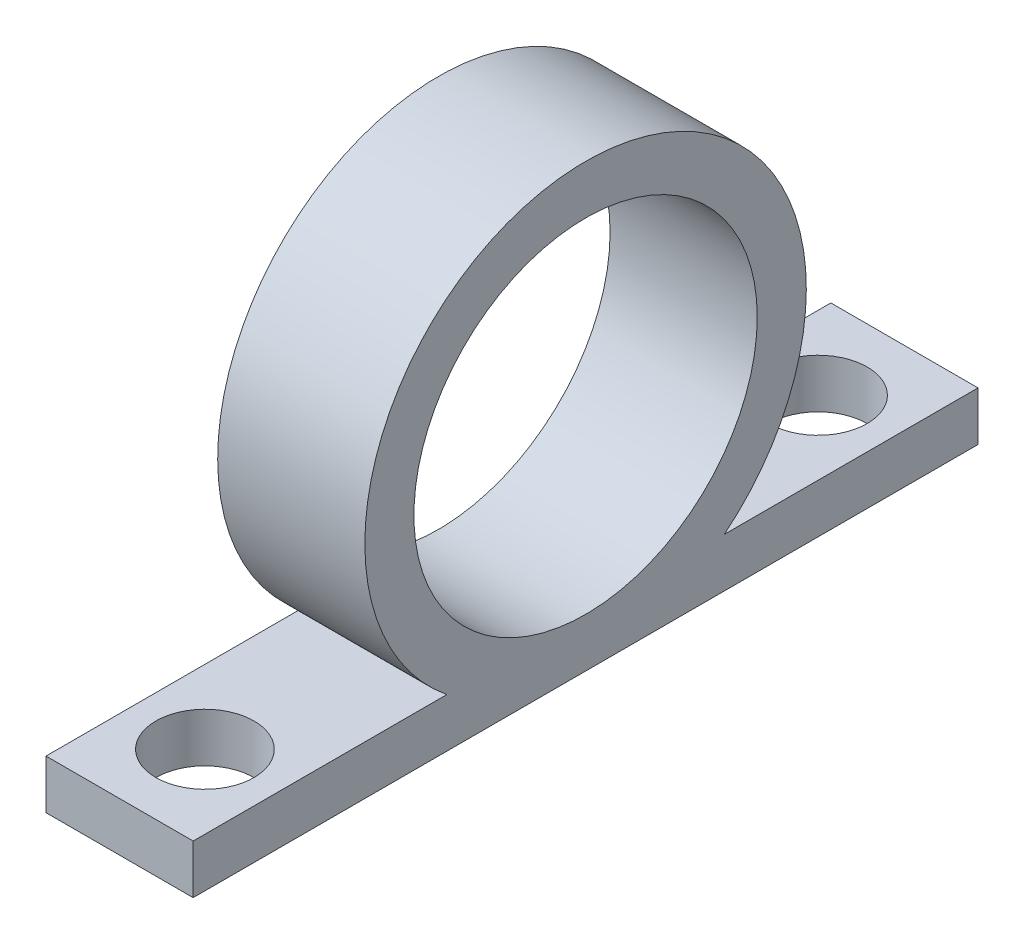
ISO-10303-21;
HEADER;
FILE_DESCRIPTION(('STEP AP214'),'2;1');
FILE_NAME('part.step','',(''),(''),'','','');
FILE_SCHEMA(('AUTOMOTIVE_DESIGN { 1 0 10303 214 1 1 1 1 }'));
ENDSEC;
DATA;
#1=APPLICATION_CONTEXT('core data for automotive mechanical design processes');
#2=APPLICATION_PROTOCOL_DEFINITION('international standard','automotive_design',2000,#1);
#3=PRODUCT_CONTEXT('',#1,'mechanical');
#4=PRODUCT('Part','Part','',(#3));
#5=PRODUCT_RELATED_PRODUCT_CATEGORY('part','',(#4));
#6=PRODUCT_DEFINITION_FORMATION('','',#4);
#7=PRODUCT_DEFINITION_CONTEXT('part definition',#1,'design');
#8=PRODUCT_DEFINITION('design','',#6,#7);
#9=PRODUCT_DEFINITION_SHAPE('','',#8);
#10=(LENGTH_UNIT() NAMED_UNIT(*) SI_UNIT(.MILLI.,.METRE.));
#11=(NAMED_UNIT(*) PLANE_ANGLE_UNIT() SI_UNIT($,.RADIAN.));
#12=(NAMED_UNIT(*) SI_UNIT($,.STERADIAN.) SOLID_ANGLE_UNIT());
#13=UNCERTAINTY_MEASURE_WITH_UNIT(LENGTH_MEASURE(1.E-05),#10,'distance_accuracy_value','');
#14=(GEOMETRIC_REPRESENTATION_CONTEXT(3) GLOBAL_UNCERTAINTY_ASSIGNED_CONTEXT((#13)) GLOBAL_UNIT_ASSIGNED_CONTEXT((#10,
#11,#12)) REPRESENTATION_CONTEXT('',''));
#15=CARTESIAN_POINT('',(0.,0.,0.));
#16=DIRECTION('',(0.,0.,1.));
#17=DIRECTION('',(1.,0.,0.));
#18=AXIS2_PLACEMENT_3D('',#15,#16,#17);
#19=CARTESIAN_POINT('',(30.,0.,0.));
#20=DIRECTION('',(1.,0.,0.));
#21=DIRECTION('',(0.,0.,-1.));
#22=AXIS2_PLACEMENT_3D('',#19,#20,#21);
#23=PLANE('',#22);
#24=CARTESIAN_POINT('',(30.,0.,0.));
#25=DIRECTION('',(1.,0.,0.));
#26=DIRECTION('',(0.,0.,-1.));
#27=AXIS2_PLACEMENT_3D('',#24,#25,#26);
#28=CIRCLE('',#27,45.);
#29=CARTESIAN_POINT('',(30.,-35.,-28.2842712474619));
#30=VERTEX_POINT('',#29);
#31=CARTESIAN_POINT('',(30.,-35.,28.2842712474619));
#32=VERTEX_POINT('',#31);
#33=EDGE_CURVE('E147',#30,#32,#28,.T.);
#34=ORIENTED_EDGE('',*,*,#33,.T.);
#35=DIRECTION('',(0.,0.,1.));
#36=VECTOR('',#35,1.);
#37=CARTESIAN_POINT('',(30.,-35.,80.));
#38=LINE('',#37,#36);
#39=CARTESIAN_POINT('',(30.,-35.,80.));
#40=VERTEX_POINT('',#39);
#41=EDGE_CURVE('E95',#32,#40,#38,.T.);
#42=ORIENTED_EDGE('',*,*,#41,.T.);
#43=DIRECTION('',(0.,-1.,0.));
#44=VECTOR('',#43,1.);
#45=CARTESIAN_POINT('',(30.,-45.,80.));
#46=LINE('',#45,#44);
#47=CARTESIAN_POINT('',(30.,-45.,80.));
#48=VERTEX_POINT('',#47);
#49=EDGE_CURVE('E108',#40,#48,#46,.T.);
#50=ORIENTED_EDGE('',*,*,#49,.T.);
#51=DIRECTION('',(0.,0.,-1.));
#52=VECTOR('',#51,1.);
#53=CARTESIAN_POINT('',(30.,-45.,0.));
#54=LINE('',#53,#52);
#55=CARTESIAN_POINT('',(30.,-45.,-80.));
#56=VERTEX_POINT('',#55);
#57=EDGE_CURVE('E102',#48,#56,#54,.T.);
#58=ORIENTED_EDGE('',*,*,#57,.T.);
#59=DIRECTION('',(0.,1.,0.));
#60=VECTOR('',#59,1.);
#61=CARTESIAN_POINT('',(30.,-35.,-80.));
#62=LINE('',#61,#60);
#63=CARTESIAN_POINT('',(30.,-35.,-80.));
#64=VERTEX_POINT('',#63);
#65=EDGE_CURVE('E106',#56,#64,#62,.T.);
#66=ORIENTED_EDGE('',*,*,#65,.T.);
#67=DIRECTION('',(0.,0.,1.));
#68=VECTOR('',#67,1.);
#69=CARTESIAN_POINT('',(30.,-35.,-28.2842712474619));
#70=LINE('',#69,#68);
#71=EDGE_CURVE('E58',#64,#30,#70,.T.);
#72=ORIENTED_EDGE('',*,*,#71,.T.);
#73=EDGE_LOOP('',(#34,#42,#50,#58,#66,#72));
#74=FACE_BOUND('',#73,.T.);
#75=CARTESIAN_POINT('',(30.,0.,0.));
#76=DIRECTION('',(1.,0.,0.));
#77=DIRECTION('',(0.,0.,-1.));
#78=AXIS2_PLACEMENT_3D('',#75,#76,#77);
#79=CIRCLE('',#78,35.);
#80=CARTESIAN_POINT('',(30.,0.,-35.));
#81=VERTEX_POINT('',#80);
#82=EDGE_CURVE('E134',#81,#81,#79,.T.);
#83=ORIENTED_EDGE('',*,*,#82,.F.);
#84=EDGE_LOOP('',(#83));
#85=FACE_BOUND('',#84,.T.);
#86=ADVANCED_FACE('F39',(#74,#85),#23,.T.);
#87=CARTESIAN_POINT('',(0.,0.,0.));
#88=DIRECTION('',(1.,0.,0.));
#89=DIRECTION('',(0.,0.,-1.));
#90=AXIS2_PLACEMENT_3D('',#87,#88,#89);
#91=PLANE('',#90);
#92=CARTESIAN_POINT('',(0.,0.,0.));
#93=DIRECTION('',(1.,0.,0.));
#94=DIRECTION('',(0.,0.,-1.));
#95=AXIS2_PLACEMENT_3D('',#92,#93,#94);
#96=CIRCLE('',#95,45.);
#97=CARTESIAN_POINT('',(0.,-35.,-28.2842712474619));
#98=VERTEX_POINT('',#97);
#99=CARTESIAN_POINT('',(0.,-35.,28.2842712474619));
#100=VERTEX_POINT('',#99);
#101=EDGE_CURVE('E129',#98,#100,#96,.T.);
#102=ORIENTED_EDGE('',*,*,#101,.F.);
#103=DIRECTION('',(0.,0.,1.));
#104=VECTOR('',#103,1.);
#105=CARTESIAN_POINT('',(0.,-35.,-28.2842712474619));
#106=LINE('',#105,#104);
#107=CARTESIAN_POINT('',(0.,-35.,-80.));
#108=VERTEX_POINT('',#107);
#109=EDGE_CURVE('E87',#108,#98,#106,.T.);
#110=ORIENTED_EDGE('',*,*,#109,.F.);
#111=DIRECTION('',(0.,1.,0.));
#112=VECTOR('',#111,1.);
#113=CARTESIAN_POINT('',(0.,-35.,-80.));
#114=LINE('',#113,#112);
#115=CARTESIAN_POINT('',(0.,-45.,-80.));
#116=VERTEX_POINT('',#115);
#117=EDGE_CURVE('E81',#116,#108,#114,.T.);
#118=ORIENTED_EDGE('',*,*,#117,.F.);
#119=DIRECTION('',(0.,0.,-1.));
#120=VECTOR('',#119,1.);
#121=CARTESIAN_POINT('',(0.,-45.,0.));
#122=LINE('',#121,#120);
#123=CARTESIAN_POINT('',(0.,-45.,80.));
#124=VERTEX_POINT('',#123);
#125=EDGE_CURVE('E116',#124,#116,#122,.T.);
#126=ORIENTED_EDGE('',*,*,#125,.F.);
#127=DIRECTION('',(0.,-1.,0.));
#128=VECTOR('',#127,1.);
#129=CARTESIAN_POINT('',(0.,-45.,80.));
#130=LINE('',#129,#128);
#131=CARTESIAN_POINT('',(0.,-35.,80.));
#132=VERTEX_POINT('',#131);
#133=EDGE_CURVE('E137',#132,#124,#130,.T.);
#134=ORIENTED_EDGE('',*,*,#133,.F.);
#135=DIRECTION('',(0.,0.,1.));
#136=VECTOR('',#135,1.);
#137=CARTESIAN_POINT('',(0.,-35.,80.));
#138=LINE('',#137,#136);
#139=EDGE_CURVE('E133',#100,#132,#138,.T.);
#140=ORIENTED_EDGE('',*,*,#139,.F.);
#141=EDGE_LOOP('',(#102,#110,#118,#126,#134,#140));
#142=FACE_BOUND('',#141,.T.);
#143=CARTESIAN_POINT('',(0.,0.,0.));
#144=DIRECTION('',(1.,0.,0.));
#145=DIRECTION('',(0.,0.,-1.));
#146=AXIS2_PLACEMENT_3D('',#143,#144,#145);
#147=CIRCLE('',#146,35.);
#148=CARTESIAN_POINT('',(0.,0.,-35.));
#149=VERTEX_POINT('',#148);
#150=EDGE_CURVE('E203',#149,#149,#147,.T.);
#151=ORIENTED_EDGE('',*,*,#150,.T.);
#152=EDGE_LOOP('',(#151));
#153=FACE_BOUND('',#152,.T.);
#154=ADVANCED_FACE('F161',(#142,#153),#91,.F.);
#155=CARTESIAN_POINT('',(30.,0.,0.));
#156=DIRECTION('',(-1.,0.,0.));
#157=DIRECTION('',(0.,0.,1.));
#158=AXIS2_PLACEMENT_3D('',#155,#156,#157);
#159=CYLINDRICAL_SURFACE('',#158,45.);
#160=ORIENTED_EDGE('',*,*,#101,.T.);
#161=DIRECTION('',(-1.,0.,0.));
#162=VECTOR('',#161,1.);
#163=CARTESIAN_POINT('',(30.,-35.,28.2842712474619));
#164=LINE('',#163,#162);
#165=EDGE_CURVE('E11',#32,#100,#164,.T.);
#166=ORIENTED_EDGE('',*,*,#165,.F.);
#167=ORIENTED_EDGE('',*,*,#33,.F.);
#168=DIRECTION('',(-1.,0.,0.));
#169=VECTOR('',#168,1.);
#170=CARTESIAN_POINT('',(30.,-35.,-28.2842712474619));
#171=LINE('',#170,#169);
#172=EDGE_CURVE('E125',#30,#98,#171,.T.);
#173=ORIENTED_EDGE('',*,*,#172,.T.);
#174=EDGE_LOOP('',(#160,#166,#167,#173));
#175=FACE_BOUND('',#174,.T.);
#176=ADVANCED_FACE('F41',(#175),#159,.T.);
#177=CARTESIAN_POINT('',(30.,-35.,80.));
#178=DIRECTION('',(0.,-1.,0.));
#179=DIRECTION('',(0.,0.,-1.));
#180=AXIS2_PLACEMENT_3D('',#177,#178,#179);
#181=PLANE('',#180);
#182=CARTESIAN_POINT('',(15.,-35.,62.6006153094143));
#183=DIRECTION('',(0.,1.,0.));
#184=DIRECTION('',(0.,0.,1.));
#185=AXIS2_PLACEMENT_3D('',#182,#183,#184);
#186=CIRCLE('',#185,10.);
#187=CARTESIAN_POINT('',(15.,-35.,72.6006153094143));
#188=VERTEX_POINT('',#187);
#189=EDGE_CURVE('E198',#188,#188,#186,.T.);
#190=ORIENTED_EDGE('',*,*,#189,.F.);
#191=EDGE_LOOP('',(#190));
#192=FACE_BOUND('',#191,.T.);
#193=ORIENTED_EDGE('',*,*,#139,.T.);
#194=DIRECTION('',(-1.,0.,0.));
#195=VECTOR('',#194,1.);
#196=CARTESIAN_POINT('',(30.,-35.,80.));
#197=LINE('',#196,#195);
#198=EDGE_CURVE('E50',#40,#132,#197,.T.);
#199=ORIENTED_EDGE('',*,*,#198,.F.);
#200=ORIENTED_EDGE('',*,*,#41,.F.);
#201=ORIENTED_EDGE('',*,*,#165,.T.);
#202=EDGE_LOOP('',(#193,#199,#200,#201));
#203=FACE_BOUND('',#202,.T.);
#204=ADVANCED_FACE('F236',(#192,#203),#181,.F.);
#205=CARTESIAN_POINT('',(30.,-45.,80.));
#206=DIRECTION('',(0.,0.,-1.));
#207=DIRECTION('',(-1.,0.,0.));
#208=AXIS2_PLACEMENT_3D('',#205,#206,#207);
#209=PLANE('',#208);
#210=ORIENTED_EDGE('',*,*,#133,.T.);
#211=DIRECTION('',(-1.,0.,0.));
#212=VECTOR('',#211,1.);
#213=CARTESIAN_POINT('',(30.,-45.,80.));
#214=LINE('',#213,#212);
#215=EDGE_CURVE('E118',#48,#124,#214,.T.);
#216=ORIENTED_EDGE('',*,*,#215,.F.);
#217=ORIENTED_EDGE('',*,*,#49,.F.);
#218=ORIENTED_EDGE('',*,*,#198,.T.);
#219=EDGE_LOOP('',(#210,#216,#217,#218));
#220=FACE_BOUND('',#219,.T.);
#221=ADVANCED_FACE('F158',(#220),#209,.F.);
#222=CARTESIAN_POINT('',(30.,-45.,0.));
#223=DIRECTION('',(0.,1.,0.));
#224=DIRECTION('',(0.,0.,1.));
#225=AXIS2_PLACEMENT_3D('',#222,#223,#224);
#226=PLANE('',#225);
#227=CARTESIAN_POINT('',(15.,-45.,62.6006153094143));
#228=DIRECTION('',(0.,1.,0.));
#229=DIRECTION('',(0.,0.,1.));
#230=AXIS2_PLACEMENT_3D('',#227,#228,#229);
#231=CIRCLE('',#230,10.);
#232=CARTESIAN_POINT('',(15.,-45.,72.6006153094143));
#233=VERTEX_POINT('',#232);
#234=EDGE_CURVE('E43',#233,#233,#231,.T.);
#235=ORIENTED_EDGE('',*,*,#234,.T.);
#236=EDGE_LOOP('',(#235));
#237=FACE_BOUND('',#236,.T.);
#238=CARTESIAN_POINT('',(15.,-45.,-62.3993846905857));
#239=DIRECTION('',(0.,1.,0.));
#240=DIRECTION('',(0.,0.,1.));
#241=AXIS2_PLACEMENT_3D('',#238,#239,#240);
#242=CIRCLE('',#241,10.);
#243=CARTESIAN_POINT('',(15.,-45.,-52.3993846905857));
#244=VERTEX_POINT('',#243);
#245=EDGE_CURVE('E204',#244,#244,#242,.T.);
#246=ORIENTED_EDGE('',*,*,#245,.T.);
#247=EDGE_LOOP('',(#246));
#248=FACE_BOUND('',#247,.T.);
#249=ORIENTED_EDGE('',*,*,#125,.T.);
#250=DIRECTION('',(-1.,0.,0.));
#251=VECTOR('',#250,1.);
#252=CARTESIAN_POINT('',(30.,-45.,-80.));
#253=LINE('',#252,#251);
#254=EDGE_CURVE('E114',#56,#116,#253,.T.);
#255=ORIENTED_EDGE('',*,*,#254,.F.);
#256=ORIENTED_EDGE('',*,*,#57,.F.);
#257=ORIENTED_EDGE('',*,*,#215,.T.);
#258=EDGE_LOOP('',(#249,#255,#256,#257));
#259=FACE_BOUND('',#258,.T.);
#260=ADVANCED_FACE('F115',(#237,#248,#259),#226,.F.);
#261=CARTESIAN_POINT('',(30.,-35.,-80.));
#262=DIRECTION('',(0.,0.,1.));
#263=DIRECTION('',(1.,0.,0.));
#264=AXIS2_PLACEMENT_3D('',#261,#262,#263);
#265=PLANE('',#264);
#266=ORIENTED_EDGE('',*,*,#117,.T.);
#267=DIRECTION('',(-1.,0.,0.));
#268=VECTOR('',#267,1.);
#269=CARTESIAN_POINT('',(30.,-35.,-80.));
#270=LINE('',#269,#268);
#271=EDGE_CURVE('E119',#64,#108,#270,.T.);
#272=ORIENTED_EDGE('',*,*,#271,.F.);
#273=ORIENTED_EDGE('',*,*,#65,.F.);
#274=ORIENTED_EDGE('',*,*,#254,.T.);
#275=EDGE_LOOP('',(#266,#272,#273,#274));
#276=FACE_BOUND('',#275,.T.);
#277=ADVANCED_FACE('F121',(#276),#265,.F.);
#278=CARTESIAN_POINT('',(30.,-35.,-28.2842712474619));
#279=DIRECTION('',(0.,-1.,0.));
#280=DIRECTION('',(0.,0.,-1.));
#281=AXIS2_PLACEMENT_3D('',#278,#279,#280);
#282=PLANE('',#281);
#283=CARTESIAN_POINT('',(15.,-35.,-62.3993846905857));
#284=DIRECTION('',(0.,1.,0.));
#285=DIRECTION('',(0.,0.,1.));
#286=AXIS2_PLACEMENT_3D('',#283,#284,#285);
#287=CIRCLE('',#286,10.);
#288=CARTESIAN_POINT('',(15.,-35.,-52.3993846905857));
#289=VERTEX_POINT('',#288);
#290=EDGE_CURVE('E214',#289,#289,#287,.T.);
#291=ORIENTED_EDGE('',*,*,#290,.F.);
#292=EDGE_LOOP('',(#291));
#293=FACE_BOUND('',#292,.T.);
#294=ORIENTED_EDGE('',*,*,#109,.T.);
#295=ORIENTED_EDGE('',*,*,#172,.F.);
#296=ORIENTED_EDGE('',*,*,#71,.F.);
#297=ORIENTED_EDGE('',*,*,#271,.T.);
#298=EDGE_LOOP('',(#294,#295,#296,#297));
#299=FACE_BOUND('',#298,.T.);
#300=ADVANCED_FACE('F166',(#293,#299),#282,.F.);
#301=CARTESIAN_POINT('',(30.,0.,0.));
#302=DIRECTION('',(-1.,0.,0.));
#303=DIRECTION('',(0.,0.,1.));
#304=AXIS2_PLACEMENT_3D('',#301,#302,#303);
#305=CYLINDRICAL_SURFACE('',#304,35.);
#306=ORIENTED_EDGE('',*,*,#82,.T.);
#307=EDGE_LOOP('',(#306));
#308=FACE_BOUND('',#307,.T.);
#309=ORIENTED_EDGE('',*,*,#150,.F.);
#310=EDGE_LOOP('',(#309));
#311=FACE_BOUND('',#310,.T.);
#312=ADVANCED_FACE('F168',(#308,#311),#305,.F.);
#313=CARTESIAN_POINT('',(15.,-65.,-62.3993846905857));
#314=DIRECTION('',(0.,1.,0.));
#315=DIRECTION('',(0.,0.,1.));
#316=AXIS2_PLACEMENT_3D('',#313,#314,#315);
#317=CYLINDRICAL_SURFACE('',#316,10.);
#318=ORIENTED_EDGE('',*,*,#290,.T.);
#319=EDGE_LOOP('',(#318));
#320=FACE_BOUND('',#319,.T.);
#321=ORIENTED_EDGE('',*,*,#245,.F.);
#322=EDGE_LOOP('',(#321));
#323=FACE_BOUND('',#322,.T.);
#324=ADVANCED_FACE('F175',(#320,#323),#317,.F.);
#325=CARTESIAN_POINT('',(15.,-65.,62.6006153094143));
#326=DIRECTION('',(0.,1.,0.));
#327=DIRECTION('',(0.,0.,1.));
#328=AXIS2_PLACEMENT_3D('',#325,#326,#327);
#329=CYLINDRICAL_SURFACE('',#328,10.);
#330=ORIENTED_EDGE('',*,*,#189,.T.);
#331=EDGE_LOOP('',(#330));
#332=FACE_BOUND('',#331,.T.);
#333=ORIENTED_EDGE('',*,*,#234,.F.);
#334=EDGE_LOOP('',(#333));
#335=FACE_BOUND('',#334,.T.);
#336=ADVANCED_FACE('F189',(#332,#335),#329,.F.);
#337=CLOSED_SHELL('',(#86,#154,#176,#204,#221,#260,#277,#300,#312,#324,#336));
#338=MANIFOLD_SOLID_BREP('B2',#337);
#339=ADVANCED_BREP_SHAPE_REPRESENTATION('',(#18,#338),#14);
#340=SHAPE_DEFINITION_REPRESENTATION(#9,#339);
ENDSEC;
END-ISO-10303-21;
